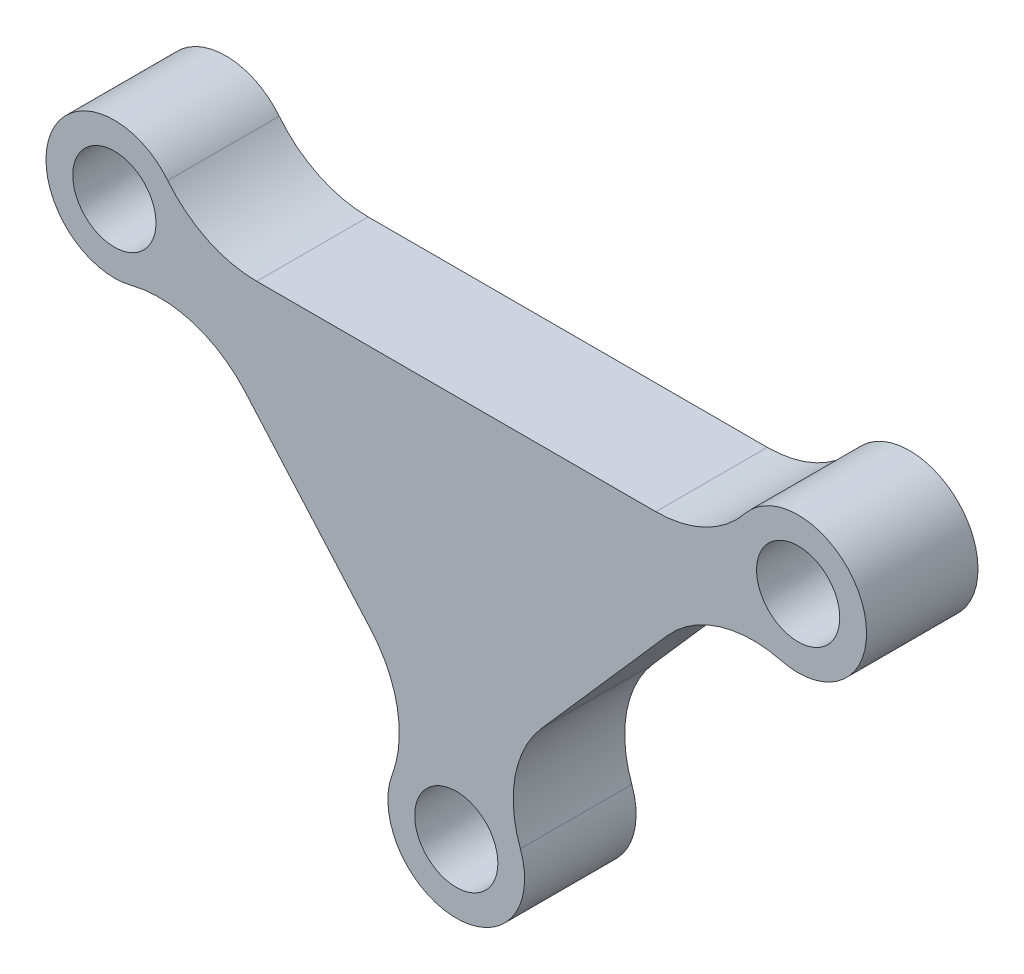
ISO-10303-21;
HEADER;
FILE_DESCRIPTION(('STEP AP214'),'2;1');
FILE_NAME('part.step','',(''),(''),'','','');
FILE_SCHEMA(('AUTOMOTIVE_DESIGN { 1 0 10303 214 1 1 1 1 }'));
ENDSEC;
DATA;
#1=APPLICATION_CONTEXT('core data for automotive mechanical design processes');
#2=APPLICATION_PROTOCOL_DEFINITION('international standard','automotive_design',2000,#1);
#3=PRODUCT_CONTEXT('',#1,'mechanical');
#4=PRODUCT('Part','Part','',(#3));
#5=PRODUCT_RELATED_PRODUCT_CATEGORY('part','',(#4));
#6=PRODUCT_DEFINITION_FORMATION('','',#4);
#7=PRODUCT_DEFINITION_CONTEXT('part definition',#1,'design');
#8=PRODUCT_DEFINITION('design','',#6,#7);
#9=PRODUCT_DEFINITION_SHAPE('','',#8);
#10=(LENGTH_UNIT() NAMED_UNIT(*) SI_UNIT(.MILLI.,.METRE.));
#11=(NAMED_UNIT(*) PLANE_ANGLE_UNIT() SI_UNIT($,.RADIAN.));
#12=(NAMED_UNIT(*) SI_UNIT($,.STERADIAN.) SOLID_ANGLE_UNIT());
#13=UNCERTAINTY_MEASURE_WITH_UNIT(LENGTH_MEASURE(1.E-05),#10,'distance_accuracy_value','');
#14=(GEOMETRIC_REPRESENTATION_CONTEXT(3) GLOBAL_UNCERTAINTY_ASSIGNED_CONTEXT((#13)) GLOBAL_UNIT_ASSIGNED_CONTEXT((#10,
#11,#12)) REPRESENTATION_CONTEXT('',''));
#15=CARTESIAN_POINT('',(0.,0.,0.));
#16=DIRECTION('',(0.,0.,1.));
#17=DIRECTION('',(1.,0.,0.));
#18=AXIS2_PLACEMENT_3D('',#15,#16,#17);
#19=CARTESIAN_POINT('',(0.,0.,4.89));
#20=DIRECTION('',(0.,0.,1.));
#21=DIRECTION('',(1.,0.,0.));
#22=AXIS2_PLACEMENT_3D('',#19,#20,#21);
#23=PLANE('',#22);
#24=CARTESIAN_POINT('',(-15.,10.,4.89));
#25=DIRECTION('',(0.,0.,1.));
#26=DIRECTION('',(1.,0.,0.));
#27=AXIS2_PLACEMENT_3D('',#24,#25,#26);
#28=CIRCLE('',#27,1.825);
#29=CARTESIAN_POINT('',(-13.175,10.,4.89));
#30=VERTEX_POINT('',#29);
#31=EDGE_CURVE('E428',#30,#30,#28,.T.);
#32=ORIENTED_EDGE('',*,*,#31,.F.);
#33=EDGE_LOOP('',(#32));
#34=FACE_BOUND('',#33,.T.);
#35=CARTESIAN_POINT('',(15.,10.,4.89));
#36=DIRECTION('',(0.,0.,1.));
#37=DIRECTION('',(1.,0.,0.));
#38=AXIS2_PLACEMENT_3D('',#35,#36,#37);
#39=CIRCLE('',#38,1.825);
#40=CARTESIAN_POINT('',(16.825,10.,4.89));
#41=VERTEX_POINT('',#40);
#42=EDGE_CURVE('E418',#41,#41,#39,.T.);
#43=ORIENTED_EDGE('',*,*,#42,.F.);
#44=EDGE_LOOP('',(#43));
#45=FACE_BOUND('',#44,.T.);
#46=CARTESIAN_POINT('',(0.,-6.825,4.89));
#47=DIRECTION('',(0.,0.,1.));
#48=DIRECTION('',(1.,0.,0.));
#49=AXIS2_PLACEMENT_3D('',#46,#47,#48);
#50=CIRCLE('',#49,1.825);
#51=CARTESIAN_POINT('',(1.825,-6.825,4.89));
#52=VERTEX_POINT('',#51);
#53=EDGE_CURVE('E417',#52,#52,#50,.T.);
#54=ORIENTED_EDGE('',*,*,#53,.F.);
#55=EDGE_LOOP('',(#54));
#56=FACE_BOUND('',#55,.T.);
#57=DIRECTION('',(-0.659921886299402,0.751334215900647,0.));
#58=VECTOR('',#57,1.);
#59=CARTESIAN_POINT('',(-2.47910946499218,-2.1774844800848,4.89));
#60=LINE('',#59,#58);
#61=CARTESIAN_POINT('',(-3.74245116446397,-0.739144784291498,4.89));
#62=VERTEX_POINT('',#61);
#63=CARTESIAN_POINT('',(-9.26477937711987,5.54813591322946,4.89));
#64=VERTEX_POINT('',#63);
#65=EDGE_CURVE('E403',#62,#64,#60,.T.);
#66=ORIENTED_EDGE('',*,*,#65,.F.);
#67=CARTESIAN_POINT('',(-7.4991222439672,-4.0387542157885,4.89));
#68=DIRECTION('',(0.,0.,1.));
#69=DIRECTION('',(1.,0.,0.));
#70=AXIS2_PLACEMENT_3D('',#67,#68,#69);
#71=CIRCLE('',#70,5.);
#72=CARTESIAN_POINT('',(-2.8121708414877,-5.78015783092069,4.89));
#73=VERTEX_POINT('',#72);
#74=EDGE_CURVE('E371',#62,#73,#71,.F.);
#75=ORIENTED_EDGE('',*,*,#74,.T.);
#76=CARTESIAN_POINT('',(0.,-6.825,4.89));
#77=DIRECTION('',(0.,0.,1.));
#78=DIRECTION('',(1.,0.,0.));
#79=AXIS2_PLACEMENT_3D('',#76,#77,#78);
#80=CIRCLE('',#79,3.);
#81=CARTESIAN_POINT('',(2.8121708414877,-5.78015783092069,4.89));
#82=VERTEX_POINT('',#81);
#83=EDGE_CURVE('E400',#73,#82,#80,.T.);
#84=ORIENTED_EDGE('',*,*,#83,.T.);
#85=CARTESIAN_POINT('',(7.4991222439672,-4.0387542157885,4.89));
#86=DIRECTION('',(0.,0.,1.));
#87=DIRECTION('',(1.,0.,0.));
#88=AXIS2_PLACEMENT_3D('',#85,#86,#87);
#89=CIRCLE('',#88,5.);
#90=CARTESIAN_POINT('',(3.74245116446397,-0.739144784291498,4.89));
#91=VERTEX_POINT('',#90);
#92=EDGE_CURVE('E12',#82,#91,#89,.F.);
#93=ORIENTED_EDGE('',*,*,#92,.T.);
#94=DIRECTION('',(-0.659921886299402,-0.751334215900647,0.));
#95=VECTOR('',#94,1.);
#96=CARTESIAN_POINT('',(2.47910946499218,-2.1774844800848,4.89));
#97=LINE('',#96,#95);
#98=CARTESIAN_POINT('',(9.26477937711987,5.54813591322946,4.89));
#99=VERTEX_POINT('',#98);
#100=EDGE_CURVE('E398',#99,#91,#97,.T.);
#101=ORIENTED_EDGE('',*,*,#100,.F.);
#102=CARTESIAN_POINT('',(13.0214504566231,2.24852648173245,4.89));
#103=DIRECTION('',(0.,0.,1.));
#104=DIRECTION('',(1.,0.,0.));
#105=AXIS2_PLACEMENT_3D('',#102,#103,#104);
#106=CIRCLE('',#105,5.);
#107=CARTESIAN_POINT('',(14.2580439212337,7.09319743064967,4.89));
#108=VERTEX_POINT('',#107);
#109=EDGE_CURVE('E375',#99,#108,#106,.F.);
#110=ORIENTED_EDGE('',*,*,#109,.T.);
#111=CARTESIAN_POINT('',(15.,10.,4.89));
#112=DIRECTION('',(0.,0.,1.));
#113=DIRECTION('',(1.,0.,0.));
#114=AXIS2_PLACEMENT_3D('',#111,#112,#113);
#115=CIRCLE('',#114,3.);
#116=CARTESIAN_POINT('',(12.6581257506006,11.875,4.89));
#117=VERTEX_POINT('',#116);
#118=EDGE_CURVE('E410',#108,#117,#115,.T.);
#119=ORIENTED_EDGE('',*,*,#118,.T.);
#120=CARTESIAN_POINT('',(8.7550020016016,15.,4.89));
#121=DIRECTION('',(0.,0.,1.));
#122=DIRECTION('',(1.,0.,0.));
#123=AXIS2_PLACEMENT_3D('',#120,#121,#122);
#124=CIRCLE('',#123,5.);
#125=CARTESIAN_POINT('',(8.7550020016016,10.,4.89));
#126=VERTEX_POINT('',#125);
#127=EDGE_CURVE('E379',#117,#126,#124,.F.);
#128=ORIENTED_EDGE('',*,*,#127,.T.);
#129=DIRECTION('',(1.,0.,0.));
#130=VECTOR('',#129,1.);
#131=CARTESIAN_POINT('',(0.,10.,4.89));
#132=LINE('',#131,#130);
#133=CARTESIAN_POINT('',(-8.7550020016016,10.,4.89));
#134=VERTEX_POINT('',#133);
#135=EDGE_CURVE('E318',#134,#126,#132,.T.);
#136=ORIENTED_EDGE('',*,*,#135,.F.);
#137=CARTESIAN_POINT('',(-8.7550020016016,15.,4.89));
#138=DIRECTION('',(0.,0.,1.));
#139=DIRECTION('',(1.,0.,0.));
#140=AXIS2_PLACEMENT_3D('',#137,#138,#139);
#141=CIRCLE('',#140,5.);
#142=CARTESIAN_POINT('',(-12.6581257506006,11.875,4.89));
#143=VERTEX_POINT('',#142);
#144=EDGE_CURVE('E312',#134,#143,#141,.F.);
#145=ORIENTED_EDGE('',*,*,#144,.T.);
#146=CARTESIAN_POINT('',(-15.,10.,4.89));
#147=DIRECTION('',(0.,0.,1.));
#148=DIRECTION('',(1.,0.,0.));
#149=AXIS2_PLACEMENT_3D('',#146,#147,#148);
#150=CIRCLE('',#149,3.);
#151=CARTESIAN_POINT('',(-14.2580439212337,7.09319743064967,4.89));
#152=VERTEX_POINT('',#151);
#153=EDGE_CURVE('E315',#143,#152,#150,.T.);
#154=ORIENTED_EDGE('',*,*,#153,.T.);
#155=CARTESIAN_POINT('',(-13.0214504566231,2.24852648173245,4.89));
#156=DIRECTION('',(0.,0.,1.));
#157=DIRECTION('',(1.,0.,0.));
#158=AXIS2_PLACEMENT_3D('',#155,#156,#157);
#159=CIRCLE('',#158,5.);
#160=EDGE_CURVE('E367',#152,#64,#159,.F.);
#161=ORIENTED_EDGE('',*,*,#160,.T.);
#162=EDGE_LOOP('',(#66,#75,#84,#93,#101,#110,#119,#128,#136,#145,#154,#161));
#163=FACE_BOUND('',#162,.T.);
#164=ADVANCED_FACE('F223',(#34,#45,#56,#163),#23,.T.);
#165=CARTESIAN_POINT('',(0.,0.,0.));
#166=DIRECTION('',(0.,0.,1.));
#167=DIRECTION('',(1.,0.,0.));
#168=AXIS2_PLACEMENT_3D('',#165,#166,#167);
#169=PLANE('',#168);
#170=CARTESIAN_POINT('',(-15.,10.,0.));
#171=DIRECTION('',(0.,0.,1.));
#172=DIRECTION('',(1.,0.,0.));
#173=AXIS2_PLACEMENT_3D('',#170,#171,#172);
#174=CIRCLE('',#173,1.825);
#175=CARTESIAN_POINT('',(-13.175,10.,0.));
#176=VERTEX_POINT('',#175);
#177=EDGE_CURVE('E431',#176,#176,#174,.T.);
#178=ORIENTED_EDGE('',*,*,#177,.T.);
#179=EDGE_LOOP('',(#178));
#180=FACE_BOUND('',#179,.T.);
#181=CARTESIAN_POINT('',(15.,10.,0.));
#182=DIRECTION('',(0.,0.,1.));
#183=DIRECTION('',(1.,0.,0.));
#184=AXIS2_PLACEMENT_3D('',#181,#182,#183);
#185=CIRCLE('',#184,1.825);
#186=CARTESIAN_POINT('',(16.825,10.,0.));
#187=VERTEX_POINT('',#186);
#188=EDGE_CURVE('E333',#187,#187,#185,.T.);
#189=ORIENTED_EDGE('',*,*,#188,.T.);
#190=EDGE_LOOP('',(#189));
#191=FACE_BOUND('',#190,.T.);
#192=CARTESIAN_POINT('',(0.,-6.825,0.));
#193=DIRECTION('',(0.,0.,1.));
#194=DIRECTION('',(1.,0.,0.));
#195=AXIS2_PLACEMENT_3D('',#192,#193,#194);
#196=CIRCLE('',#195,1.825);
#197=CARTESIAN_POINT('',(1.825,-6.825,0.));
#198=VERTEX_POINT('',#197);
#199=EDGE_CURVE('E407',#198,#198,#196,.T.);
#200=ORIENTED_EDGE('',*,*,#199,.T.);
#201=EDGE_LOOP('',(#200));
#202=FACE_BOUND('',#201,.T.);
#203=CARTESIAN_POINT('',(15.,10.,0.));
#204=DIRECTION('',(0.,0.,1.));
#205=DIRECTION('',(1.,0.,0.));
#206=AXIS2_PLACEMENT_3D('',#203,#204,#205);
#207=CIRCLE('',#206,3.);
#208=CARTESIAN_POINT('',(14.2580439212337,7.09319743064967,0.));
#209=VERTEX_POINT('',#208);
#210=CARTESIAN_POINT('',(12.6581257506006,11.875,0.));
#211=VERTEX_POINT('',#210);
#212=EDGE_CURVE('E421',#209,#211,#207,.T.);
#213=ORIENTED_EDGE('',*,*,#212,.F.);
#214=CARTESIAN_POINT('',(13.0214504566231,2.24852648173245,0.));
#215=DIRECTION('',(0.,0.,1.));
#216=DIRECTION('',(1.,0.,0.));
#217=AXIS2_PLACEMENT_3D('',#214,#215,#216);
#218=CIRCLE('',#217,5.);
#219=CARTESIAN_POINT('',(9.26477937711987,5.54813591322946,0.));
#220=VERTEX_POINT('',#219);
#221=EDGE_CURVE('E373',#209,#220,#218,.T.);
#222=ORIENTED_EDGE('',*,*,#221,.T.);
#223=DIRECTION('',(-0.659921886299402,-0.751334215900647,0.));
#224=VECTOR('',#223,1.);
#225=CARTESIAN_POINT('',(2.47910946499218,-2.1774844800848,0.));
#226=LINE('',#225,#224);
#227=CARTESIAN_POINT('',(3.74245116446397,-0.739144784291498,0.));
#228=VERTEX_POINT('',#227);
#229=EDGE_CURVE('E387',#220,#228,#226,.T.);
#230=ORIENTED_EDGE('',*,*,#229,.T.);
#231=CARTESIAN_POINT('',(7.4991222439672,-4.0387542157885,0.));
#232=DIRECTION('',(0.,0.,1.));
#233=DIRECTION('',(1.,0.,0.));
#234=AXIS2_PLACEMENT_3D('',#231,#232,#233);
#235=CIRCLE('',#234,5.);
#236=CARTESIAN_POINT('',(2.8121708414877,-5.78015783092069,0.));
#237=VERTEX_POINT('',#236);
#238=EDGE_CURVE('E231',#228,#237,#235,.T.);
#239=ORIENTED_EDGE('',*,*,#238,.T.);
#240=CARTESIAN_POINT('',(0.,-6.825,0.));
#241=DIRECTION('',(0.,0.,1.));
#242=DIRECTION('',(1.,0.,0.));
#243=AXIS2_PLACEMENT_3D('',#240,#241,#242);
#244=CIRCLE('',#243,3.);
#245=CARTESIAN_POINT('',(-2.8121708414877,-5.78015783092069,0.));
#246=VERTEX_POINT('',#245);
#247=EDGE_CURVE('E386',#246,#237,#244,.T.);
#248=ORIENTED_EDGE('',*,*,#247,.F.);
#249=CARTESIAN_POINT('',(-7.4991222439672,-4.0387542157885,0.));
#250=DIRECTION('',(0.,0.,1.));
#251=DIRECTION('',(1.,0.,0.));
#252=AXIS2_PLACEMENT_3D('',#249,#250,#251);
#253=CIRCLE('',#252,5.);
#254=CARTESIAN_POINT('',(-3.74245116446397,-0.739144784291498,0.));
#255=VERTEX_POINT('',#254);
#256=EDGE_CURVE('E369',#246,#255,#253,.T.);
#257=ORIENTED_EDGE('',*,*,#256,.T.);
#258=DIRECTION('',(-0.659921886299402,0.751334215900647,0.));
#259=VECTOR('',#258,1.);
#260=CARTESIAN_POINT('',(-2.47910946499218,-2.1774844800848,0.));
#261=LINE('',#260,#259);
#262=CARTESIAN_POINT('',(-9.26477937711987,5.54813591322946,0.));
#263=VERTEX_POINT('',#262);
#264=EDGE_CURVE('E395',#255,#263,#261,.T.);
#265=ORIENTED_EDGE('',*,*,#264,.T.);
#266=CARTESIAN_POINT('',(-13.0214504566231,2.24852648173245,0.));
#267=DIRECTION('',(0.,0.,1.));
#268=DIRECTION('',(1.,0.,0.));
#269=AXIS2_PLACEMENT_3D('',#266,#267,#268);
#270=CIRCLE('',#269,5.);
#271=CARTESIAN_POINT('',(-14.2580439212337,7.09319743064967,0.));
#272=VERTEX_POINT('',#271);
#273=EDGE_CURVE('E322',#263,#272,#270,.T.);
#274=ORIENTED_EDGE('',*,*,#273,.T.);
#275=CARTESIAN_POINT('',(-15.,10.,0.));
#276=DIRECTION('',(0.,0.,1.));
#277=DIRECTION('',(1.,0.,0.));
#278=AXIS2_PLACEMENT_3D('',#275,#276,#277);
#279=CIRCLE('',#278,3.);
#280=CARTESIAN_POINT('',(-12.6581257506006,11.875,0.));
#281=VERTEX_POINT('',#280);
#282=EDGE_CURVE('E334',#281,#272,#279,.T.);
#283=ORIENTED_EDGE('',*,*,#282,.F.);
#284=CARTESIAN_POINT('',(-8.7550020016016,15.,0.));
#285=DIRECTION('',(0.,0.,1.));
#286=DIRECTION('',(1.,0.,0.));
#287=AXIS2_PLACEMENT_3D('',#284,#285,#286);
#288=CIRCLE('',#287,5.);
#289=CARTESIAN_POINT('',(-8.7550020016016,10.,0.));
#290=VERTEX_POINT('',#289);
#291=EDGE_CURVE('E323',#281,#290,#288,.T.);
#292=ORIENTED_EDGE('',*,*,#291,.T.);
#293=DIRECTION('',(1.,0.,0.));
#294=VECTOR('',#293,1.);
#295=CARTESIAN_POINT('',(0.,10.,0.));
#296=LINE('',#295,#294);
#297=CARTESIAN_POINT('',(8.7550020016016,10.,0.));
#298=VERTEX_POINT('',#297);
#299=EDGE_CURVE('E414',#290,#298,#296,.T.);
#300=ORIENTED_EDGE('',*,*,#299,.T.);
#301=CARTESIAN_POINT('',(8.7550020016016,15.,0.));
#302=DIRECTION('',(0.,0.,1.));
#303=DIRECTION('',(1.,0.,0.));
#304=AXIS2_PLACEMENT_3D('',#301,#302,#303);
#305=CIRCLE('',#304,5.);
#306=EDGE_CURVE('E377',#298,#211,#305,.T.);
#307=ORIENTED_EDGE('',*,*,#306,.T.);
#308=EDGE_LOOP('',(#213,#222,#230,#239,#248,#257,#265,#274,#283,#292,#300,#307));
#309=FACE_BOUND('',#308,.T.);
#310=ADVANCED_FACE('F385',(#180,#191,#202,#309),#169,.F.);
#311=CARTESIAN_POINT('',(0.,-6.825,4.89));
#312=DIRECTION('',(0.,0.,-1.));
#313=DIRECTION('',(-1.,0.,0.));
#314=AXIS2_PLACEMENT_3D('',#311,#312,#313);
#315=CYLINDRICAL_SURFACE('',#314,1.825);
#316=ORIENTED_EDGE('',*,*,#199,.F.);
#317=EDGE_LOOP('',(#316));
#318=FACE_BOUND('',#317,.T.);
#319=ORIENTED_EDGE('',*,*,#53,.T.);
#320=EDGE_LOOP('',(#319));
#321=FACE_BOUND('',#320,.T.);
#322=ADVANCED_FACE('F446',(#318,#321),#315,.F.);
#323=CARTESIAN_POINT('',(0.,-6.825,4.89));
#324=DIRECTION('',(0.,0.,-1.));
#325=DIRECTION('',(-1.,0.,0.));
#326=AXIS2_PLACEMENT_3D('',#323,#324,#325);
#327=CYLINDRICAL_SURFACE('',#326,3.);
#328=ORIENTED_EDGE('',*,*,#83,.F.);
#329=DIRECTION('',(0.,0.,-1.));
#330=VECTOR('',#329,1.);
#331=CARTESIAN_POINT('',(-2.8121708414877,-5.78015783092069,4.89));
#332=LINE('',#331,#330);
#333=EDGE_CURVE('E353',#73,#246,#332,.T.);
#334=ORIENTED_EDGE('',*,*,#333,.T.);
#335=ORIENTED_EDGE('',*,*,#247,.T.);
#336=DIRECTION('',(0.,0.,-1.));
#337=VECTOR('',#336,1.);
#338=CARTESIAN_POINT('',(2.8121708414877,-5.78015783092069,4.89));
#339=LINE('',#338,#337);
#340=EDGE_CURVE('E351',#237,#82,#339,.F.);
#341=ORIENTED_EDGE('',*,*,#340,.T.);
#342=EDGE_LOOP('',(#328,#334,#335,#341));
#343=FACE_BOUND('',#342,.T.);
#344=ADVANCED_FACE('F393',(#343),#327,.T.);
#345=CARTESIAN_POINT('',(2.47910946499218,-2.1774844800848,4.89));
#346=DIRECTION('',(0.751334215900647,-0.659921886299401,0.));
#347=DIRECTION('',(0.659921886299402,0.751334215900647,0.));
#348=AXIS2_PLACEMENT_3D('',#345,#346,#347);
#349=PLANE('',#348);
#350=ORIENTED_EDGE('',*,*,#229,.F.);
#351=DIRECTION('',(0.,0.,-1.));
#352=VECTOR('',#351,1.);
#353=CARTESIAN_POINT('',(9.26477937711987,5.54813591322946,4.89));
#354=LINE('',#353,#352);
#355=EDGE_CURVE('E243',#220,#99,#354,.F.);
#356=ORIENTED_EDGE('',*,*,#355,.T.);
#357=ORIENTED_EDGE('',*,*,#100,.T.);
#358=DIRECTION('',(0.,0.,-1.));
#359=VECTOR('',#358,1.);
#360=CARTESIAN_POINT('',(3.74245116446397,-0.739144784291498,4.89));
#361=LINE('',#360,#359);
#362=EDGE_CURVE('E361',#91,#228,#361,.T.);
#363=ORIENTED_EDGE('',*,*,#362,.T.);
#364=EDGE_LOOP('',(#350,#356,#357,#363));
#365=FACE_BOUND('',#364,.T.);
#366=ADVANCED_FACE('F397',(#365),#349,.T.);
#367=CARTESIAN_POINT('',(0.,10.,4.89));
#368=DIRECTION('',(0.,1.,0.));
#369=DIRECTION('',(0.,0.,1.));
#370=AXIS2_PLACEMENT_3D('',#367,#368,#369);
#371=PLANE('',#370);
#372=ORIENTED_EDGE('',*,*,#299,.F.);
#373=DIRECTION('',(0.,0.,-1.));
#374=VECTOR('',#373,1.);
#375=CARTESIAN_POINT('',(-8.7550020016016,10.,4.89));
#376=LINE('',#375,#374);
#377=EDGE_CURVE('E340',#290,#134,#376,.F.);
#378=ORIENTED_EDGE('',*,*,#377,.T.);
#379=ORIENTED_EDGE('',*,*,#135,.T.);
#380=DIRECTION('',(0.,0.,-1.));
#381=VECTOR('',#380,1.);
#382=CARTESIAN_POINT('',(8.7550020016016,10.,4.89));
#383=LINE('',#382,#381);
#384=EDGE_CURVE('E337',#126,#298,#383,.T.);
#385=ORIENTED_EDGE('',*,*,#384,.T.);
#386=EDGE_LOOP('',(#372,#378,#379,#385));
#387=FACE_BOUND('',#386,.T.);
#388=ADVANCED_FACE('F462',(#387),#371,.T.);
#389=CARTESIAN_POINT('',(-2.47910946499218,-2.1774844800848,4.89));
#390=DIRECTION('',(-0.751334215900647,-0.659921886299401,0.));
#391=DIRECTION('',(0.659921886299402,-0.751334215900647,0.));
#392=AXIS2_PLACEMENT_3D('',#389,#390,#391);
#393=PLANE('',#392);
#394=ORIENTED_EDGE('',*,*,#65,.T.);
#395=DIRECTION('',(0.,0.,-1.));
#396=VECTOR('',#395,1.);
#397=CARTESIAN_POINT('',(-9.26477937711987,5.54813591322945,4.89));
#398=LINE('',#397,#396);
#399=EDGE_CURVE('E348',#64,#263,#398,.T.);
#400=ORIENTED_EDGE('',*,*,#399,.T.);
#401=ORIENTED_EDGE('',*,*,#264,.F.);
#402=DIRECTION('',(0.,0.,-1.));
#403=VECTOR('',#402,1.);
#404=CARTESIAN_POINT('',(-3.74245116446397,-0.739144784291499,4.89));
#405=LINE('',#404,#403);
#406=EDGE_CURVE('E346',#255,#62,#405,.F.);
#407=ORIENTED_EDGE('',*,*,#406,.T.);
#408=EDGE_LOOP('',(#394,#400,#401,#407));
#409=FACE_BOUND('',#408,.T.);
#410=ADVANCED_FACE('F439',(#409),#393,.T.);
#411=CARTESIAN_POINT('',(15.,10.,4.89));
#412=DIRECTION('',(0.,0.,-1.));
#413=DIRECTION('',(-1.,0.,0.));
#414=AXIS2_PLACEMENT_3D('',#411,#412,#413);
#415=CYLINDRICAL_SURFACE('',#414,1.825);
#416=ORIENTED_EDGE('',*,*,#188,.F.);
#417=EDGE_LOOP('',(#416));
#418=FACE_BOUND('',#417,.T.);
#419=ORIENTED_EDGE('',*,*,#42,.T.);
#420=EDGE_LOOP('',(#419));
#421=FACE_BOUND('',#420,.T.);
#422=ADVANCED_FACE('F461',(#418,#421),#415,.F.);
#423=CARTESIAN_POINT('',(15.,10.,4.89));
#424=DIRECTION('',(0.,0.,-1.));
#425=DIRECTION('',(-1.,0.,0.));
#426=AXIS2_PLACEMENT_3D('',#423,#424,#425);
#427=CYLINDRICAL_SURFACE('',#426,3.);
#428=ORIENTED_EDGE('',*,*,#118,.F.);
#429=DIRECTION('',(0.,0.,-1.));
#430=VECTOR('',#429,1.);
#431=CARTESIAN_POINT('',(14.2580439212337,7.09319743064967,4.89));
#432=LINE('',#431,#430);
#433=EDGE_CURVE('E358',#108,#209,#432,.T.);
#434=ORIENTED_EDGE('',*,*,#433,.T.);
#435=ORIENTED_EDGE('',*,*,#212,.T.);
#436=DIRECTION('',(0.,0.,-1.));
#437=VECTOR('',#436,1.);
#438=CARTESIAN_POINT('',(12.6581257506006,11.875,4.89));
#439=LINE('',#438,#437);
#440=EDGE_CURVE('E356',#211,#117,#439,.F.);
#441=ORIENTED_EDGE('',*,*,#440,.T.);
#442=EDGE_LOOP('',(#428,#434,#435,#441));
#443=FACE_BOUND('',#442,.T.);
#444=ADVANCED_FACE('F468',(#443),#427,.T.);
#445=CARTESIAN_POINT('',(-15.,10.,4.89));
#446=DIRECTION('',(0.,0.,-1.));
#447=DIRECTION('',(-1.,0.,0.));
#448=AXIS2_PLACEMENT_3D('',#445,#446,#447);
#449=CYLINDRICAL_SURFACE('',#448,1.825);
#450=ORIENTED_EDGE('',*,*,#177,.F.);
#451=EDGE_LOOP('',(#450));
#452=FACE_BOUND('',#451,.T.);
#453=ORIENTED_EDGE('',*,*,#31,.T.);
#454=EDGE_LOOP('',(#453));
#455=FACE_BOUND('',#454,.T.);
#456=ADVANCED_FACE('F473',(#452,#455),#449,.F.);
#457=CARTESIAN_POINT('',(-15.,10.,4.89));
#458=DIRECTION('',(0.,0.,-1.));
#459=DIRECTION('',(-1.,0.,0.));
#460=AXIS2_PLACEMENT_3D('',#457,#458,#459);
#461=CYLINDRICAL_SURFACE('',#460,3.);
#462=ORIENTED_EDGE('',*,*,#153,.F.);
#463=DIRECTION('',(0.,0.,-1.));
#464=VECTOR('',#463,1.);
#465=CARTESIAN_POINT('',(-12.6581257506006,11.875,4.89));
#466=LINE('',#465,#464);
#467=EDGE_CURVE('E329',#143,#281,#466,.T.);
#468=ORIENTED_EDGE('',*,*,#467,.T.);
#469=ORIENTED_EDGE('',*,*,#282,.T.);
#470=DIRECTION('',(0.,0.,-1.));
#471=VECTOR('',#470,1.);
#472=CARTESIAN_POINT('',(-14.2580439212337,7.09319743064967,4.89));
#473=LINE('',#472,#471);
#474=EDGE_CURVE('E332',#272,#152,#473,.F.);
#475=ORIENTED_EDGE('',*,*,#474,.T.);
#476=EDGE_LOOP('',(#462,#468,#469,#475));
#477=FACE_BOUND('',#476,.T.);
#478=ADVANCED_FACE('F327',(#477),#461,.T.);
#479=CARTESIAN_POINT('',(-8.7550020016016,15.,4.89));
#480=DIRECTION('',(0.,0.,-1.));
#481=DIRECTION('',(-1.,0.,0.));
#482=AXIS2_PLACEMENT_3D('',#479,#480,#481);
#483=CYLINDRICAL_SURFACE('',#482,5.);
#484=ORIENTED_EDGE('',*,*,#144,.F.);
#485=ORIENTED_EDGE('',*,*,#377,.F.);
#486=ORIENTED_EDGE('',*,*,#291,.F.);
#487=ORIENTED_EDGE('',*,*,#467,.F.);
#488=EDGE_LOOP('',(#484,#485,#486,#487));
#489=FACE_BOUND('',#488,.T.);
#490=ADVANCED_FACE('F336',(#489),#483,.F.);
#491=CARTESIAN_POINT('',(-13.0214504566231,2.24852648173245,4.89));
#492=DIRECTION('',(0.,0.,-1.));
#493=DIRECTION('',(-1.,0.,0.));
#494=AXIS2_PLACEMENT_3D('',#491,#492,#493);
#495=CYLINDRICAL_SURFACE('',#494,5.);
#496=ORIENTED_EDGE('',*,*,#160,.F.);
#497=ORIENTED_EDGE('',*,*,#474,.F.);
#498=ORIENTED_EDGE('',*,*,#273,.F.);
#499=ORIENTED_EDGE('',*,*,#399,.F.);
#500=EDGE_LOOP('',(#496,#497,#498,#499));
#501=FACE_BOUND('',#500,.T.);
#502=ADVANCED_FACE('F434',(#501),#495,.F.);
#503=CARTESIAN_POINT('',(-7.4991222439672,-4.0387542157885,4.89));
#504=DIRECTION('',(0.,0.,-1.));
#505=DIRECTION('',(-1.,0.,0.));
#506=AXIS2_PLACEMENT_3D('',#503,#504,#505);
#507=CYLINDRICAL_SURFACE('',#506,5.);
#508=ORIENTED_EDGE('',*,*,#74,.F.);
#509=ORIENTED_EDGE('',*,*,#406,.F.);
#510=ORIENTED_EDGE('',*,*,#256,.F.);
#511=ORIENTED_EDGE('',*,*,#333,.F.);
#512=EDGE_LOOP('',(#508,#509,#510,#511));
#513=FACE_BOUND('',#512,.T.);
#514=ADVANCED_FACE('F487',(#513),#507,.F.);
#515=CARTESIAN_POINT('',(13.0214504566231,2.24852648173245,4.89));
#516=DIRECTION('',(0.,0.,-1.));
#517=DIRECTION('',(-1.,0.,0.));
#518=AXIS2_PLACEMENT_3D('',#515,#516,#517);
#519=CYLINDRICAL_SURFACE('',#518,5.);
#520=ORIENTED_EDGE('',*,*,#109,.F.);
#521=ORIENTED_EDGE('',*,*,#355,.F.);
#522=ORIENTED_EDGE('',*,*,#221,.F.);
#523=ORIENTED_EDGE('',*,*,#433,.F.);
#524=EDGE_LOOP('',(#520,#521,#522,#523));
#525=FACE_BOUND('',#524,.T.);
#526=ADVANCED_FACE('F490',(#525),#519,.F.);
#527=CARTESIAN_POINT('',(8.7550020016016,15.,4.89));
#528=DIRECTION('',(0.,0.,-1.));
#529=DIRECTION('',(-1.,0.,0.));
#530=AXIS2_PLACEMENT_3D('',#527,#528,#529);
#531=CYLINDRICAL_SURFACE('',#530,5.);
#532=ORIENTED_EDGE('',*,*,#127,.F.);
#533=ORIENTED_EDGE('',*,*,#440,.F.);
#534=ORIENTED_EDGE('',*,*,#306,.F.);
#535=ORIENTED_EDGE('',*,*,#384,.F.);
#536=EDGE_LOOP('',(#532,#533,#534,#535));
#537=FACE_BOUND('',#536,.T.);
#538=ADVANCED_FACE('F493',(#537),#531,.F.);
#539=CARTESIAN_POINT('',(7.4991222439672,-4.0387542157885,4.89));
#540=DIRECTION('',(0.,0.,-1.));
#541=DIRECTION('',(-1.,0.,0.));
#542=AXIS2_PLACEMENT_3D('',#539,#540,#541);
#543=CYLINDRICAL_SURFACE('',#542,5.);
#544=ORIENTED_EDGE('',*,*,#92,.F.);
#545=ORIENTED_EDGE('',*,*,#340,.F.);
#546=ORIENTED_EDGE('',*,*,#238,.F.);
#547=ORIENTED_EDGE('',*,*,#362,.F.);
#548=EDGE_LOOP('',(#544,#545,#546,#547));
#549=FACE_BOUND('',#548,.T.);
#550=ADVANCED_FACE('F225',(#549),#543,.F.);
#551=CLOSED_SHELL('',(#164,#310,#322,#344,#366,#388,#410,#422,#444,#456,#478,#490,#502,#514,
#526,#538,#550));
#552=MANIFOLD_SOLID_BREP('B2',#551);
#553=ADVANCED_BREP_SHAPE_REPRESENTATION('',(#18,#552),#14);
#554=SHAPE_DEFINITION_REPRESENTATION(#9,#553);
ENDSEC;
END-ISO-10303-21;
